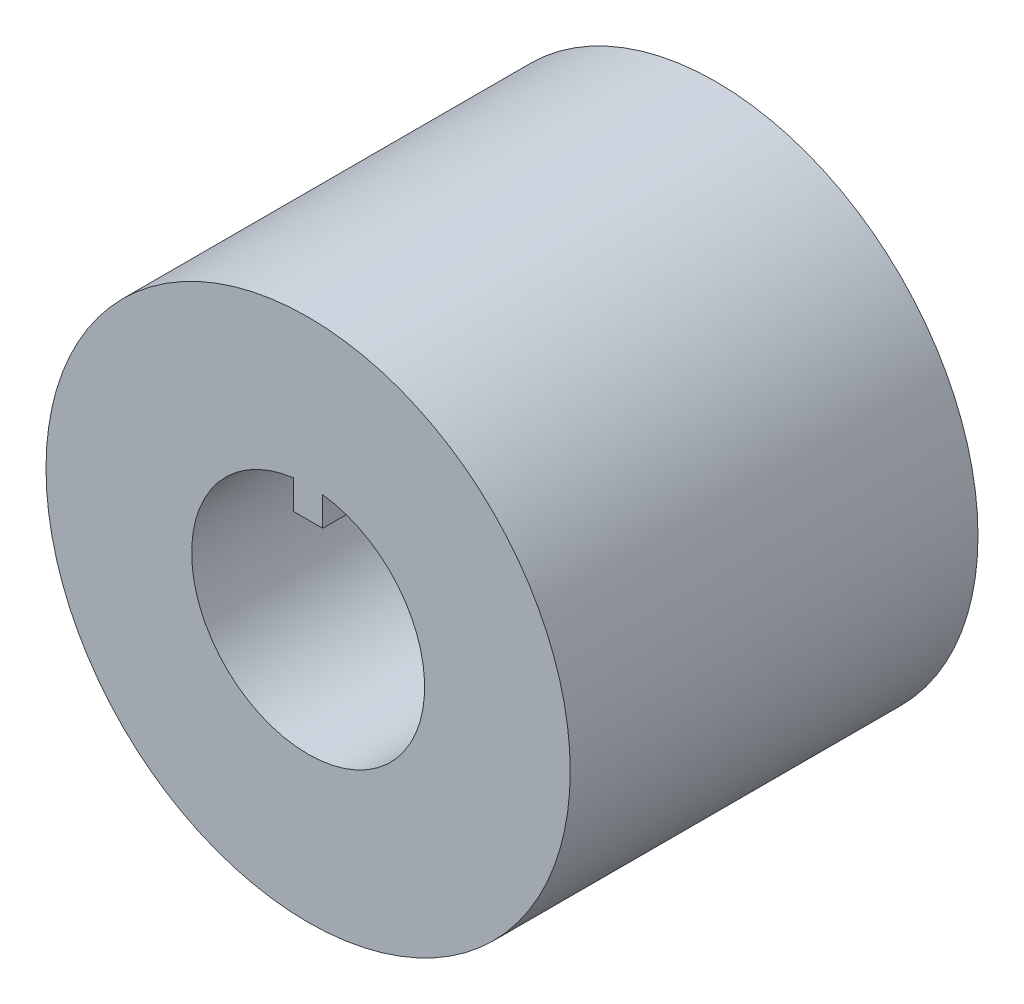
ISO-10303-21;
HEADER;
FILE_DESCRIPTION(('STEP AP214'),'2;1');
FILE_NAME('part.step','',(''),(''),'','','');
FILE_SCHEMA(('AUTOMOTIVE_DESIGN { 1 0 10303 214 1 1 1 1 }'));
ENDSEC;
DATA;
#1=APPLICATION_CONTEXT('core data for automotive mechanical design processes');
#2=APPLICATION_PROTOCOL_DEFINITION('international standard','automotive_design',2000,#1);
#3=PRODUCT_CONTEXT('',#1,'mechanical');
#4=PRODUCT('Part','Part','',(#3));
#5=PRODUCT_RELATED_PRODUCT_CATEGORY('part','',(#4));
#6=PRODUCT_DEFINITION_FORMATION('','',#4);
#7=PRODUCT_DEFINITION_CONTEXT('part definition',#1,'design');
#8=PRODUCT_DEFINITION('design','',#6,#7);
#9=PRODUCT_DEFINITION_SHAPE('','',#8);
#10=(LENGTH_UNIT() NAMED_UNIT(*) SI_UNIT(.MILLI.,.METRE.));
#11=(NAMED_UNIT(*) PLANE_ANGLE_UNIT() SI_UNIT($,.RADIAN.));
#12=(NAMED_UNIT(*) SI_UNIT($,.STERADIAN.) SOLID_ANGLE_UNIT());
#13=UNCERTAINTY_MEASURE_WITH_UNIT(LENGTH_MEASURE(1.E-05),#10,'distance_accuracy_value','');
#14=(GEOMETRIC_REPRESENTATION_CONTEXT(3) GLOBAL_UNCERTAINTY_ASSIGNED_CONTEXT((#13)) GLOBAL_UNIT_ASSIGNED_CONTEXT((#10,
#11,#12)) REPRESENTATION_CONTEXT('',''));
#15=CARTESIAN_POINT('',(0.,0.,0.));
#16=DIRECTION('',(0.,0.,1.));
#17=DIRECTION('',(1.,0.,0.));
#18=AXIS2_PLACEMENT_3D('',#15,#16,#17);
#19=CARTESIAN_POINT('',(0.,0.,140.));
#20=DIRECTION('',(0.,0.,1.));
#21=DIRECTION('',(1.,0.,0.));
#22=AXIS2_PLACEMENT_3D('',#19,#20,#21);
#23=PLANE('',#22);
#24=CARTESIAN_POINT('',(0.,0.,140.));
#25=DIRECTION('',(0.,0.,1.));
#26=DIRECTION('',(1.,0.,0.));
#27=AXIS2_PLACEMENT_3D('',#24,#25,#26);
#28=CIRCLE('',#27,90.);
#29=CARTESIAN_POINT('',(90.,0.,140.));
#30=VERTEX_POINT('',#29);
#31=EDGE_CURVE('E11',#30,#30,#28,.T.);
#32=ORIENTED_EDGE('',*,*,#31,.T.);
#33=EDGE_LOOP('',(#32));
#34=FACE_BOUND('',#33,.T.);
#35=DIRECTION('',(0.00619279339329,-0.999980824471143,0.));
#36=VECTOR('',#35,1.);
#37=CARTESIAN_POINT('',(5.,29.6862696659689,140.));
#38=LINE('',#37,#36);
#39=CARTESIAN_POINT('',(4.93802282626902,39.6940289031895,140.));
#40=VERTEX_POINT('',#39);
#41=CARTESIAN_POINT('',(5.,29.6862696659689,140.));
#42=VERTEX_POINT('',#41);
#43=EDGE_CURVE('E82',#40,#42,#38,.T.);
#44=ORIENTED_EDGE('',*,*,#43,.F.);
#45=CARTESIAN_POINT('',(0.,0.,140.));
#46=DIRECTION('',(0.,0.,1.));
#47=DIRECTION('',(1.,0.,0.));
#48=AXIS2_PLACEMENT_3D('',#45,#46,#47);
#49=CIRCLE('',#48,40.);
#50=CARTESIAN_POINT('',(-5.,39.6862696659689,140.));
#51=VERTEX_POINT('',#50);
#52=EDGE_CURVE('E74',#51,#40,#49,.T.);
#53=ORIENTED_EDGE('',*,*,#52,.F.);
#54=DIRECTION('',(0.,1.,0.));
#55=VECTOR('',#54,1.);
#56=CARTESIAN_POINT('',(-5.,39.6862696659689,140.));
#57=LINE('',#56,#55);
#58=CARTESIAN_POINT('',(-5.,29.6862696659689,140.));
#59=VERTEX_POINT('',#58);
#60=EDGE_CURVE('E95',#59,#51,#57,.T.);
#61=ORIENTED_EDGE('',*,*,#60,.F.);
#62=DIRECTION('',(-1.,0.,0.));
#63=VECTOR('',#62,1.);
#64=CARTESIAN_POINT('',(-5.,29.6862696659689,140.));
#65=LINE('',#64,#63);
#66=EDGE_CURVE('E93',#42,#59,#65,.T.);
#67=ORIENTED_EDGE('',*,*,#66,.F.);
#68=EDGE_LOOP('',(#44,#53,#61,#67));
#69=FACE_BOUND('',#68,.T.);
#70=ADVANCED_FACE('F33',(#34,#69),#23,.T.);
#71=CARTESIAN_POINT('',(0.,0.,0.));
#72=DIRECTION('',(0.,0.,1.));
#73=DIRECTION('',(1.,0.,0.));
#74=AXIS2_PLACEMENT_3D('',#71,#72,#73);
#75=PLANE('',#74);
#76=CARTESIAN_POINT('',(0.,0.,0.));
#77=DIRECTION('',(0.,0.,1.));
#78=DIRECTION('',(1.,0.,0.));
#79=AXIS2_PLACEMENT_3D('',#76,#77,#78);
#80=CIRCLE('',#79,90.);
#81=CARTESIAN_POINT('',(90.,0.,0.));
#82=VERTEX_POINT('',#81);
#83=EDGE_CURVE('E37',#82,#82,#80,.T.);
#84=ORIENTED_EDGE('',*,*,#83,.F.);
#85=EDGE_LOOP('',(#84));
#86=FACE_BOUND('',#85,.T.);
#87=CARTESIAN_POINT('',(0.,0.,0.));
#88=DIRECTION('',(0.,0.,1.));
#89=DIRECTION('',(1.,0.,0.));
#90=AXIS2_PLACEMENT_3D('',#87,#88,#89);
#91=CIRCLE('',#90,40.);
#92=CARTESIAN_POINT('',(-5.,39.6862696659689,0.));
#93=VERTEX_POINT('',#92);
#94=CARTESIAN_POINT('',(4.93802282626902,39.6940289031895,0.));
#95=VERTEX_POINT('',#94);
#96=EDGE_CURVE('E56',#93,#95,#91,.T.);
#97=ORIENTED_EDGE('',*,*,#96,.T.);
#98=DIRECTION('',(0.00619279339329,-0.999980824471143,0.));
#99=VECTOR('',#98,1.);
#100=CARTESIAN_POINT('',(5.,29.6862696659689,0.));
#101=LINE('',#100,#99);
#102=CARTESIAN_POINT('',(5.,29.6862696659689,0.));
#103=VERTEX_POINT('',#102);
#104=EDGE_CURVE('E89',#95,#103,#101,.T.);
#105=ORIENTED_EDGE('',*,*,#104,.T.);
#106=DIRECTION('',(-1.,0.,0.));
#107=VECTOR('',#106,1.);
#108=CARTESIAN_POINT('',(-5.,29.6862696659689,0.));
#109=LINE('',#108,#107);
#110=CARTESIAN_POINT('',(-5.,29.6862696659689,0.));
#111=VERTEX_POINT('',#110);
#112=EDGE_CURVE('E101',#103,#111,#109,.T.);
#113=ORIENTED_EDGE('',*,*,#112,.T.);
#114=DIRECTION('',(0.,1.,0.));
#115=VECTOR('',#114,1.);
#116=CARTESIAN_POINT('',(-5.,39.6862696659689,0.));
#117=LINE('',#116,#115);
#118=EDGE_CURVE('E83',#111,#93,#117,.T.);
#119=ORIENTED_EDGE('',*,*,#118,.T.);
#120=EDGE_LOOP('',(#97,#105,#113,#119));
#121=FACE_BOUND('',#120,.T.);
#122=ADVANCED_FACE('F112',(#86,#121),#75,.F.);
#123=CARTESIAN_POINT('',(0.,0.,140.));
#124=DIRECTION('',(0.,0.,-1.));
#125=DIRECTION('',(-1.,0.,0.));
#126=AXIS2_PLACEMENT_3D('',#123,#124,#125);
#127=CYLINDRICAL_SURFACE('',#126,90.);
#128=ORIENTED_EDGE('',*,*,#31,.F.);
#129=EDGE_LOOP('',(#128));
#130=FACE_BOUND('',#129,.T.);
#131=ORIENTED_EDGE('',*,*,#83,.T.);
#132=EDGE_LOOP('',(#131));
#133=FACE_BOUND('',#132,.T.);
#134=ADVANCED_FACE('F35',(#130,#133),#127,.T.);
#135=CARTESIAN_POINT('',(0.,0.,140.));
#136=DIRECTION('',(0.,0.,-1.));
#137=DIRECTION('',(-1.,0.,0.));
#138=AXIS2_PLACEMENT_3D('',#135,#136,#137);
#139=CYLINDRICAL_SURFACE('',#138,40.);
#140=ORIENTED_EDGE('',*,*,#96,.F.);
#141=DIRECTION('',(0.,0.,-1.));
#142=VECTOR('',#141,1.);
#143=CARTESIAN_POINT('',(-5.,39.6862696659689,140.));
#144=LINE('',#143,#142);
#145=EDGE_CURVE('E78',#51,#93,#144,.T.);
#146=ORIENTED_EDGE('',*,*,#145,.F.);
#147=ORIENTED_EDGE('',*,*,#52,.T.);
#148=DIRECTION('',(0.,0.,-1.));
#149=VECTOR('',#148,1.);
#150=CARTESIAN_POINT('',(4.93802282626902,39.6940289031895,140.));
#151=LINE('',#150,#149);
#152=EDGE_CURVE('E77',#40,#95,#151,.T.);
#153=ORIENTED_EDGE('',*,*,#152,.T.);
#154=EDGE_LOOP('',(#140,#146,#147,#153));
#155=FACE_BOUND('',#154,.T.);
#156=ADVANCED_FACE('F76',(#155),#139,.F.);
#157=CARTESIAN_POINT('',(5.,29.6862696659689,140.));
#158=DIRECTION('',(0.999980824471144,0.00619279339329,0.));
#159=DIRECTION('',(-0.00619279339329,0.999980824471144,0.));
#160=AXIS2_PLACEMENT_3D('',#157,#158,#159);
#161=PLANE('',#160);
#162=ORIENTED_EDGE('',*,*,#104,.F.);
#163=ORIENTED_EDGE('',*,*,#152,.F.);
#164=ORIENTED_EDGE('',*,*,#43,.T.);
#165=DIRECTION('',(0.,0.,-1.));
#166=VECTOR('',#165,1.);
#167=CARTESIAN_POINT('',(5.,29.6862696659689,140.));
#168=LINE('',#167,#166);
#169=EDGE_CURVE('E90',#42,#103,#168,.T.);
#170=ORIENTED_EDGE('',*,*,#169,.T.);
#171=EDGE_LOOP('',(#162,#163,#164,#170));
#172=FACE_BOUND('',#171,.T.);
#173=ADVANCED_FACE('F86',(#172),#161,.T.);
#174=CARTESIAN_POINT('',(-5.,29.6862696659689,140.));
#175=DIRECTION('',(0.,-1.,0.));
#176=DIRECTION('',(0.,0.,-1.));
#177=AXIS2_PLACEMENT_3D('',#174,#175,#176);
#178=PLANE('',#177);
#179=ORIENTED_EDGE('',*,*,#112,.F.);
#180=ORIENTED_EDGE('',*,*,#169,.F.);
#181=ORIENTED_EDGE('',*,*,#66,.T.);
#182=DIRECTION('',(0.,0.,-1.));
#183=VECTOR('',#182,1.);
#184=CARTESIAN_POINT('',(-5.,29.6862696659689,140.));
#185=LINE('',#184,#183);
#186=EDGE_CURVE('E48',#59,#111,#185,.T.);
#187=ORIENTED_EDGE('',*,*,#186,.T.);
#188=EDGE_LOOP('',(#179,#180,#181,#187));
#189=FACE_BOUND('',#188,.T.);
#190=ADVANCED_FACE('F110',(#189),#178,.T.);
#191=CARTESIAN_POINT('',(-5.,39.6862696659689,140.));
#192=DIRECTION('',(-1.,0.,0.));
#193=DIRECTION('',(0.,0.,1.));
#194=AXIS2_PLACEMENT_3D('',#191,#192,#193);
#195=PLANE('',#194);
#196=ORIENTED_EDGE('',*,*,#118,.F.);
#197=ORIENTED_EDGE('',*,*,#186,.F.);
#198=ORIENTED_EDGE('',*,*,#60,.T.);
#199=ORIENTED_EDGE('',*,*,#145,.T.);
#200=EDGE_LOOP('',(#196,#197,#198,#199));
#201=FACE_BOUND('',#200,.T.);
#202=ADVANCED_FACE('F113',(#201),#195,.T.);
#203=CLOSED_SHELL('',(#70,#122,#134,#156,#173,#190,#202));
#204=MANIFOLD_SOLID_BREP('B2',#203);
#205=ADVANCED_BREP_SHAPE_REPRESENTATION('',(#18,#204),#14);
#206=SHAPE_DEFINITION_REPRESENTATION(#9,#205);
ENDSEC;
END-ISO-10303-21;
